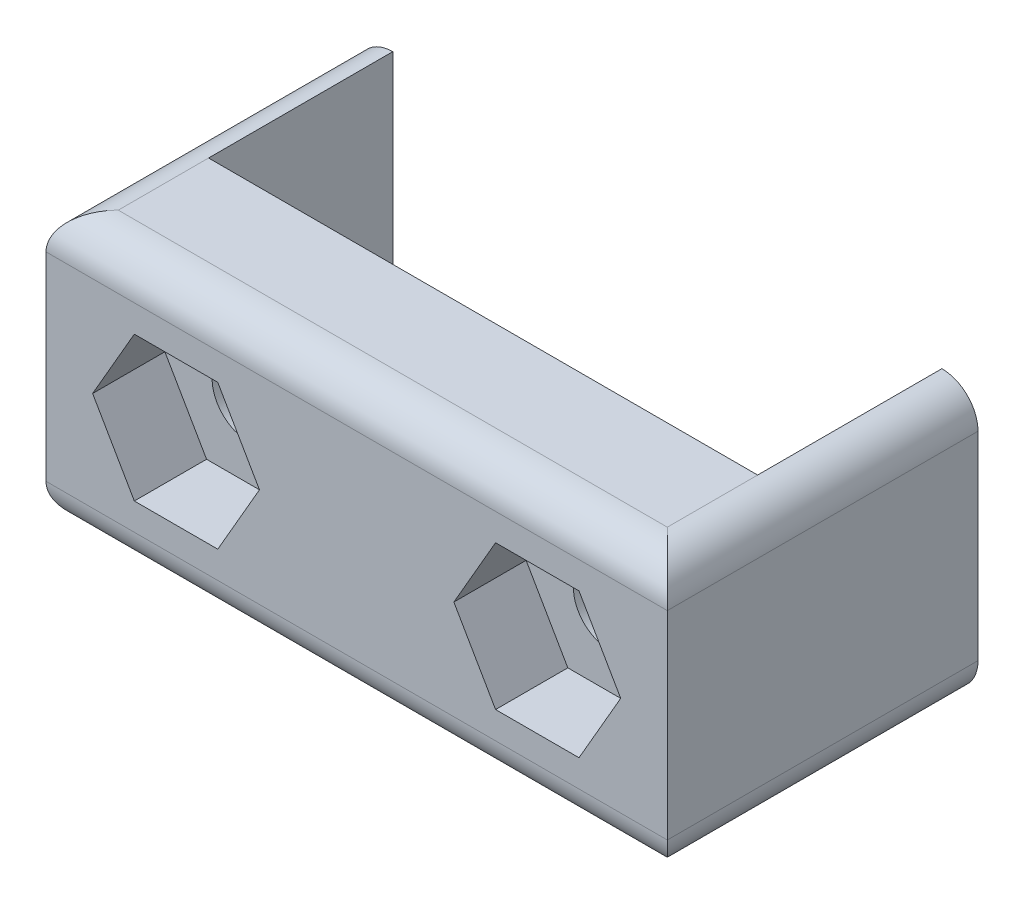
ISO-10303-21;
HEADER;
FILE_DESCRIPTION(('STEP AP214'),'2;1');
FILE_NAME('part.step','',(''),(''),'','','');
FILE_SCHEMA(('AUTOMOTIVE_DESIGN { 1 0 10303 214 1 1 1 1 }'));
ENDSEC;
DATA;
#1=APPLICATION_CONTEXT('core data for automotive mechanical design processes');
#2=APPLICATION_PROTOCOL_DEFINITION('international standard','automotive_design',2000,#1);
#3=PRODUCT_CONTEXT('',#1,'mechanical');
#4=PRODUCT('Part','Part','',(#3));
#5=PRODUCT_RELATED_PRODUCT_CATEGORY('part','',(#4));
#6=PRODUCT_DEFINITION_FORMATION('','',#4);
#7=PRODUCT_DEFINITION_CONTEXT('part definition',#1,'design');
#8=PRODUCT_DEFINITION('design','',#6,#7);
#9=PRODUCT_DEFINITION_SHAPE('','',#8);
#10=(LENGTH_UNIT() NAMED_UNIT(*) SI_UNIT(.MILLI.,.METRE.));
#11=(NAMED_UNIT(*) PLANE_ANGLE_UNIT() SI_UNIT($,.RADIAN.));
#12=(NAMED_UNIT(*) SI_UNIT($,.STERADIAN.) SOLID_ANGLE_UNIT());
#13=UNCERTAINTY_MEASURE_WITH_UNIT(LENGTH_MEASURE(1.E-05),#10,'distance_accuracy_value','');
#14=(GEOMETRIC_REPRESENTATION_CONTEXT(3) GLOBAL_UNCERTAINTY_ASSIGNED_CONTEXT((#13)) GLOBAL_UNIT_ASSIGNED_CONTEXT((#10,
#11,#12)) REPRESENTATION_CONTEXT('',''));
#15=CARTESIAN_POINT('',(0.,0.,0.));
#16=DIRECTION('',(0.,0.,1.));
#17=DIRECTION('',(1.,0.,0.));
#18=AXIS2_PLACEMENT_3D('',#15,#16,#17);
#19=CARTESIAN_POINT('',(12.7,9.525,0.));
#20=DIRECTION('',(0.,0.,1.));
#21=DIRECTION('',(1.,0.,0.));
#22=AXIS2_PLACEMENT_3D('',#19,#20,#21);
#23=CYLINDRICAL_SURFACE('',#22,2.54);
#24=CARTESIAN_POINT('',(12.7,9.525,12.954));
#25=DIRECTION('',(0.,0.,-1.));
#26=DIRECTION('',(-1.,0.,0.));
#27=AXIS2_PLACEMENT_3D('',#24,#25,#26);
#28=CIRCLE('',#27,2.54);
#29=CARTESIAN_POINT('',(10.16,9.525,12.954));
#30=VERTEX_POINT('',#29);
#31=EDGE_CURVE('E300',#30,#30,#28,.T.);
#32=ORIENTED_EDGE('',*,*,#31,.T.);
#33=EDGE_LOOP('',(#32));
#34=FACE_BOUND('',#33,.T.);
#35=CARTESIAN_POINT('',(12.7,9.525,16.764));
#36=DIRECTION('',(0.,0.,1.));
#37=DIRECTION('',(1.,0.,0.));
#38=AXIS2_PLACEMENT_3D('',#35,#36,#37);
#39=CIRCLE('',#38,2.54);
#40=CARTESIAN_POINT('',(15.24,9.525,16.764));
#41=VERTEX_POINT('',#40);
#42=EDGE_CURVE('E304',#41,#41,#39,.F.);
#43=ORIENTED_EDGE('',*,*,#42,.F.);
#44=EDGE_LOOP('',(#43));
#45=FACE_BOUND('',#44,.T.);
#46=ADVANCED_FACE('F39',(#34,#45),#23,.F.);
#47=CARTESIAN_POINT('',(-12.7,9.525,0.));
#48=DIRECTION('',(0.,0.,1.));
#49=DIRECTION('',(1.,0.,0.));
#50=AXIS2_PLACEMENT_3D('',#47,#48,#49);
#51=CYLINDRICAL_SURFACE('',#50,2.54);
#52=CARTESIAN_POINT('',(-12.7,9.525,12.954));
#53=DIRECTION('',(0.,0.,-1.));
#54=DIRECTION('',(-1.,0.,0.));
#55=AXIS2_PLACEMENT_3D('',#52,#53,#54);
#56=CIRCLE('',#55,2.54);
#57=CARTESIAN_POINT('',(-15.24,9.525,12.954));
#58=VERTEX_POINT('',#57);
#59=EDGE_CURVE('E303',#58,#58,#56,.T.);
#60=ORIENTED_EDGE('',*,*,#59,.T.);
#61=EDGE_LOOP('',(#60));
#62=FACE_BOUND('',#61,.T.);
#63=CARTESIAN_POINT('',(-12.7,9.525,16.764));
#64=DIRECTION('',(0.,0.,1.));
#65=DIRECTION('',(1.,0.,0.));
#66=AXIS2_PLACEMENT_3D('',#63,#64,#65);
#67=CIRCLE('',#66,2.54);
#68=CARTESIAN_POINT('',(-10.16,9.525,16.764));
#69=VERTEX_POINT('',#68);
#70=EDGE_CURVE('E244',#69,#69,#67,.F.);
#71=ORIENTED_EDGE('',*,*,#70,.F.);
#72=EDGE_LOOP('',(#71));
#73=FACE_BOUND('',#72,.T.);
#74=ADVANCED_FACE('F450',(#62,#73),#51,.F.);
#75=CARTESIAN_POINT('',(21.844,19.05,0.));
#76=DIRECTION('',(1.,0.,0.));
#77=DIRECTION('',(0.,0.,-1.));
#78=AXIS2_PLACEMENT_3D('',#75,#76,#77);
#79=PLANE('',#78);
#80=DIRECTION('',(0.,-1.,0.));
#81=VECTOR('',#80,1.);
#82=CARTESIAN_POINT('',(21.844,19.05,21.844));
#83=LINE('',#82,#81);
#84=CARTESIAN_POINT('',(21.844,16.51,21.844));
#85=VERTEX_POINT('',#84);
#86=CARTESIAN_POINT('',(21.844,2.54000000000001,21.844));
#87=VERTEX_POINT('',#86);
#88=EDGE_CURVE('E318',#85,#87,#83,.T.);
#89=ORIENTED_EDGE('',*,*,#88,.T.);
#90=DIRECTION('',(0.,0.,1.));
#91=VECTOR('',#90,1.);
#92=CARTESIAN_POINT('',(21.844,2.54,0.));
#93=LINE('',#92,#91);
#94=CARTESIAN_POINT('',(21.844,2.54000000000001,0.));
#95=VERTEX_POINT('',#94);
#96=EDGE_CURVE('E48',#87,#95,#93,.F.);
#97=ORIENTED_EDGE('',*,*,#96,.T.);
#98=DIRECTION('',(0.,-1.,0.));
#99=VECTOR('',#98,1.);
#100=CARTESIAN_POINT('',(21.844,19.05,0.));
#101=LINE('',#100,#99);
#102=CARTESIAN_POINT('',(21.844,16.51,0.));
#103=VERTEX_POINT('',#102);
#104=EDGE_CURVE('E342',#103,#95,#101,.T.);
#105=ORIENTED_EDGE('',*,*,#104,.F.);
#106=DIRECTION('',(0.,0.,1.));
#107=VECTOR('',#106,1.);
#108=CARTESIAN_POINT('',(21.844,16.51,0.));
#109=LINE('',#108,#107);
#110=EDGE_CURVE('E358',#103,#85,#109,.T.);
#111=ORIENTED_EDGE('',*,*,#110,.T.);
#112=EDGE_LOOP('',(#89,#97,#105,#111));
#113=FACE_BOUND('',#112,.T.);
#114=ADVANCED_FACE('F407',(#113),#79,.T.);
#115=CARTESIAN_POINT('',(0.,19.05,0.));
#116=DIRECTION('',(0.,0.,-1.));
#117=DIRECTION('',(-1.,0.,0.));
#118=AXIS2_PLACEMENT_3D('',#115,#116,#117);
#119=PLANE('',#118);
#120=ORIENTED_EDGE('',*,*,#104,.T.);
#121=CARTESIAN_POINT('',(19.304,2.54,0.));
#122=DIRECTION('',(0.,0.,-1.));
#123=DIRECTION('',(-1.,0.,0.));
#124=AXIS2_PLACEMENT_3D('',#121,#122,#123);
#125=CIRCLE('',#124,2.54);
#126=CARTESIAN_POINT('',(19.304,0.,0.));
#127=VERTEX_POINT('',#126);
#128=EDGE_CURVE('E11',#95,#127,#125,.T.);
#129=ORIENTED_EDGE('',*,*,#128,.T.);
#130=DIRECTION('',(0.,-1.,0.));
#131=VECTOR('',#130,1.);
#132=CARTESIAN_POINT('',(19.304,19.05,0.));
#133=LINE('',#132,#131);
#134=CARTESIAN_POINT('',(19.304,19.05,0.));
#135=VERTEX_POINT('',#134);
#136=EDGE_CURVE('E339',#135,#127,#133,.T.);
#137=ORIENTED_EDGE('',*,*,#136,.F.);
#138=CARTESIAN_POINT('',(19.304,16.51,0.));
#139=DIRECTION('',(0.,0.,-1.));
#140=DIRECTION('',(-1.,0.,0.));
#141=AXIS2_PLACEMENT_3D('',#138,#139,#140);
#142=CIRCLE('',#141,2.54);
#143=EDGE_CURVE('E360',#135,#103,#142,.T.);
#144=ORIENTED_EDGE('',*,*,#143,.T.);
#145=EDGE_LOOP('',(#120,#129,#137,#144));
#146=FACE_BOUND('',#145,.T.);
#147=ADVANCED_FACE('F396',(#146),#119,.T.);
#148=CARTESIAN_POINT('',(19.304,19.05,0.));
#149=DIRECTION('',(1.,0.,0.));
#150=DIRECTION('',(0.,0.,-1.));
#151=AXIS2_PLACEMENT_3D('',#148,#149,#150);
#152=PLANE('',#151);
#153=DIRECTION('',(0.,0.,1.));
#154=VECTOR('',#153,1.);
#155=CARTESIAN_POINT('',(19.304,0.,0.));
#156=LINE('',#155,#154);
#157=CARTESIAN_POINT('',(19.304,0.,12.954));
#158=VERTEX_POINT('',#157);
#159=EDGE_CURVE('E307',#127,#158,#156,.T.);
#160=ORIENTED_EDGE('',*,*,#159,.T.);
#161=DIRECTION('',(0.,-1.,0.));
#162=VECTOR('',#161,1.);
#163=CARTESIAN_POINT('',(19.304,19.05,12.954));
#164=LINE('',#163,#162);
#165=CARTESIAN_POINT('',(19.304,19.05,12.954));
#166=VERTEX_POINT('',#165);
#167=EDGE_CURVE('E337',#166,#158,#164,.T.);
#168=ORIENTED_EDGE('',*,*,#167,.F.);
#169=DIRECTION('',(0.,0.,1.));
#170=VECTOR('',#169,1.);
#171=CARTESIAN_POINT('',(19.304,19.05,0.));
#172=LINE('',#171,#170);
#173=EDGE_CURVE('E308',#135,#166,#172,.T.);
#174=ORIENTED_EDGE('',*,*,#173,.F.);
#175=ORIENTED_EDGE('',*,*,#136,.T.);
#176=EDGE_LOOP('',(#160,#168,#174,#175));
#177=FACE_BOUND('',#176,.T.);
#178=ADVANCED_FACE('F399',(#177),#152,.F.);
#179=CARTESIAN_POINT('',(0.,19.05,12.954));
#180=DIRECTION('',(0.,0.,-1.));
#181=DIRECTION('',(-1.,0.,0.));
#182=AXIS2_PLACEMENT_3D('',#179,#180,#181);
#183=PLANE('',#182);
#184=ORIENTED_EDGE('',*,*,#59,.F.);
#185=EDGE_LOOP('',(#184));
#186=FACE_BOUND('',#185,.T.);
#187=ORIENTED_EDGE('',*,*,#31,.F.);
#188=EDGE_LOOP('',(#187));
#189=FACE_BOUND('',#188,.T.);
#190=DIRECTION('',(1.,0.,0.));
#191=VECTOR('',#190,1.);
#192=CARTESIAN_POINT('',(0.,0.,12.954));
#193=LINE('',#192,#191);
#194=CARTESIAN_POINT('',(-19.304,0.,12.954));
#195=VERTEX_POINT('',#194);
#196=EDGE_CURVE('E321',#195,#158,#193,.T.);
#197=ORIENTED_EDGE('',*,*,#196,.F.);
#198=DIRECTION('',(0.,-1.,0.));
#199=VECTOR('',#198,1.);
#200=CARTESIAN_POINT('',(-19.304,19.05,12.954));
#201=LINE('',#200,#199);
#202=CARTESIAN_POINT('',(-19.304,19.05,12.954));
#203=VERTEX_POINT('',#202);
#204=EDGE_CURVE('E334',#203,#195,#201,.T.);
#205=ORIENTED_EDGE('',*,*,#204,.F.);
#206=DIRECTION('',(1.,0.,0.));
#207=VECTOR('',#206,1.);
#208=CARTESIAN_POINT('',(0.,19.05,12.954));
#209=LINE('',#208,#207);
#210=EDGE_CURVE('E311',#203,#166,#209,.T.);
#211=ORIENTED_EDGE('',*,*,#210,.T.);
#212=ORIENTED_EDGE('',*,*,#167,.T.);
#213=EDGE_LOOP('',(#197,#205,#211,#212));
#214=FACE_BOUND('',#213,.T.);
#215=ADVANCED_FACE('F435',(#186,#189,#214),#183,.T.);
#216=CARTESIAN_POINT('',(-19.304,19.05,0.));
#217=DIRECTION('',(1.,0.,0.));
#218=DIRECTION('',(0.,0.,-1.));
#219=AXIS2_PLACEMENT_3D('',#216,#217,#218);
#220=PLANE('',#219);
#221=DIRECTION('',(0.,0.,1.));
#222=VECTOR('',#221,1.);
#223=CARTESIAN_POINT('',(-19.304,0.,0.));
#224=LINE('',#223,#222);
#225=CARTESIAN_POINT('',(-19.304,0.,0.));
#226=VERTEX_POINT('',#225);
#227=EDGE_CURVE('E312',#226,#195,#224,.T.);
#228=ORIENTED_EDGE('',*,*,#227,.F.);
#229=DIRECTION('',(0.,-1.,0.));
#230=VECTOR('',#229,1.);
#231=CARTESIAN_POINT('',(-19.304,19.05,0.));
#232=LINE('',#231,#230);
#233=CARTESIAN_POINT('',(-19.304,19.05,0.));
#234=VERTEX_POINT('',#233);
#235=EDGE_CURVE('E332',#234,#226,#232,.T.);
#236=ORIENTED_EDGE('',*,*,#235,.F.);
#237=DIRECTION('',(0.,0.,1.));
#238=VECTOR('',#237,1.);
#239=CARTESIAN_POINT('',(-19.304,19.05,0.));
#240=LINE('',#239,#238);
#241=EDGE_CURVE('E315',#234,#203,#240,.T.);
#242=ORIENTED_EDGE('',*,*,#241,.T.);
#243=ORIENTED_EDGE('',*,*,#204,.T.);
#244=EDGE_LOOP('',(#228,#236,#242,#243));
#245=FACE_BOUND('',#244,.T.);
#246=ADVANCED_FACE('F431',(#245),#220,.T.);
#247=ORIENTED_EDGE('',*,*,#235,.T.);
#248=CARTESIAN_POINT('',(-19.304,2.54,0.));
#249=DIRECTION('',(0.,0.,-1.));
#250=DIRECTION('',(-1.,0.,0.));
#251=AXIS2_PLACEMENT_3D('',#248,#249,#250);
#252=CIRCLE('',#251,2.54);
#253=CARTESIAN_POINT('',(-21.844,2.54000000000001,0.));
#254=VERTEX_POINT('',#253);
#255=EDGE_CURVE('E378',#226,#254,#252,.T.);
#256=ORIENTED_EDGE('',*,*,#255,.T.);
#257=DIRECTION('',(0.,-1.,0.));
#258=VECTOR('',#257,1.);
#259=CARTESIAN_POINT('',(-21.844,19.05,0.));
#260=LINE('',#259,#258);
#261=CARTESIAN_POINT('',(-21.844,16.51,0.));
#262=VERTEX_POINT('',#261);
#263=EDGE_CURVE('E329',#262,#254,#260,.T.);
#264=ORIENTED_EDGE('',*,*,#263,.F.);
#265=CARTESIAN_POINT('',(-19.304,16.51,0.));
#266=DIRECTION('',(0.,0.,-1.));
#267=DIRECTION('',(-1.,0.,0.));
#268=AXIS2_PLACEMENT_3D('',#265,#266,#267);
#269=CIRCLE('',#268,2.54);
#270=EDGE_CURVE('E356',#262,#234,#269,.T.);
#271=ORIENTED_EDGE('',*,*,#270,.T.);
#272=EDGE_LOOP('',(#247,#256,#264,#271));
#273=FACE_BOUND('',#272,.T.);
#274=ADVANCED_FACE('F425',(#273),#119,.T.);
#275=CARTESIAN_POINT('',(-21.844,19.05,0.));
#276=DIRECTION('',(1.,0.,0.));
#277=DIRECTION('',(0.,0.,-1.));
#278=AXIS2_PLACEMENT_3D('',#275,#276,#277);
#279=PLANE('',#278);
#280=ORIENTED_EDGE('',*,*,#263,.T.);
#281=DIRECTION('',(0.,0.,1.));
#282=VECTOR('',#281,1.);
#283=CARTESIAN_POINT('',(-21.844,2.54,0.));
#284=LINE('',#283,#282);
#285=CARTESIAN_POINT('',(-21.844,2.54000000000001,21.844));
#286=VERTEX_POINT('',#285);
#287=EDGE_CURVE('E364',#254,#286,#284,.T.);
#288=ORIENTED_EDGE('',*,*,#287,.T.);
#289=DIRECTION('',(0.,-1.,0.));
#290=VECTOR('',#289,1.);
#291=CARTESIAN_POINT('',(-21.844,19.05,21.844));
#292=LINE('',#291,#290);
#293=CARTESIAN_POINT('',(-21.844,16.51,21.844));
#294=VERTEX_POINT('',#293);
#295=EDGE_CURVE('E327',#294,#286,#292,.T.);
#296=ORIENTED_EDGE('',*,*,#295,.F.);
#297=DIRECTION('',(0.,0.,1.));
#298=VECTOR('',#297,1.);
#299=CARTESIAN_POINT('',(-21.844,16.51,0.));
#300=LINE('',#299,#298);
#301=EDGE_CURVE('E354',#294,#262,#300,.F.);
#302=ORIENTED_EDGE('',*,*,#301,.T.);
#303=EDGE_LOOP('',(#280,#288,#296,#302));
#304=FACE_BOUND('',#303,.T.);
#305=ADVANCED_FACE('F423',(#304),#279,.F.);
#306=CARTESIAN_POINT('',(0.,19.05,21.844));
#307=DIRECTION('',(0.,0.,-1.));
#308=DIRECTION('',(-1.,0.,0.));
#309=AXIS2_PLACEMENT_3D('',#306,#307,#308);
#310=PLANE('',#309);
#311=DIRECTION('',(0.5,0.866025403784439,0.));
#312=VECTOR('',#311,1.);
#313=CARTESIAN_POINT('',(-9.7670606325167,4.445,21.844));
#314=LINE('',#313,#312);
#315=CARTESIAN_POINT('',(-9.7670606325167,4.445,21.844));
#316=VERTEX_POINT('',#315);
#317=CARTESIAN_POINT('',(-6.8341212650334,9.525,21.844));
#318=VERTEX_POINT('',#317);
#319=EDGE_CURVE('E231',#316,#318,#314,.T.);
#320=ORIENTED_EDGE('',*,*,#319,.F.);
#321=DIRECTION('',(1.,0.,0.));
#322=VECTOR('',#321,1.);
#323=CARTESIAN_POINT('',(-15.6329393674833,4.445,21.844));
#324=LINE('',#323,#322);
#325=CARTESIAN_POINT('',(-15.6329393674833,4.445,21.844));
#326=VERTEX_POINT('',#325);
#327=EDGE_CURVE('E198',#326,#316,#324,.T.);
#328=ORIENTED_EDGE('',*,*,#327,.F.);
#329=DIRECTION('',(0.5,-0.866025403784439,0.));
#330=VECTOR('',#329,1.);
#331=CARTESIAN_POINT('',(-18.5658787349666,9.525,21.844));
#332=LINE('',#331,#330);
#333=CARTESIAN_POINT('',(-18.5658787349666,9.525,21.844));
#334=VERTEX_POINT('',#333);
#335=EDGE_CURVE('E217',#334,#326,#332,.T.);
#336=ORIENTED_EDGE('',*,*,#335,.F.);
#337=DIRECTION('',(-0.5,-0.866025403784438,0.));
#338=VECTOR('',#337,1.);
#339=CARTESIAN_POINT('',(-15.6329393674833,14.605,21.844));
#340=LINE('',#339,#338);
#341=CARTESIAN_POINT('',(-15.6329393674833,14.605,21.844));
#342=VERTEX_POINT('',#341);
#343=EDGE_CURVE('E220',#342,#334,#340,.T.);
#344=ORIENTED_EDGE('',*,*,#343,.F.);
#345=DIRECTION('',(-1.,0.,0.));
#346=VECTOR('',#345,1.);
#347=CARTESIAN_POINT('',(-9.76706063251669,14.605,21.844));
#348=LINE('',#347,#346);
#349=CARTESIAN_POINT('',(-9.76706063251669,14.605,21.844));
#350=VERTEX_POINT('',#349);
#351=EDGE_CURVE('E237',#350,#342,#348,.T.);
#352=ORIENTED_EDGE('',*,*,#351,.F.);
#353=DIRECTION('',(-0.5,0.866025403784439,0.));
#354=VECTOR('',#353,1.);
#355=CARTESIAN_POINT('',(-6.8341212650334,9.525,21.844));
#356=LINE('',#355,#354);
#357=EDGE_CURVE('E234',#318,#350,#356,.T.);
#358=ORIENTED_EDGE('',*,*,#357,.F.);
#359=EDGE_LOOP('',(#320,#328,#336,#344,#352,#358));
#360=FACE_BOUND('',#359,.T.);
#361=DIRECTION('',(0.5,0.866025403784439,0.));
#362=VECTOR('',#361,1.);
#363=CARTESIAN_POINT('',(15.6329393674833,4.445,21.844));
#364=LINE('',#363,#362);
#365=CARTESIAN_POINT('',(15.6329393674833,4.445,21.844));
#366=VERTEX_POINT('',#365);
#367=CARTESIAN_POINT('',(18.5658787349666,9.525,21.844));
#368=VERTEX_POINT('',#367);
#369=EDGE_CURVE('E280',#366,#368,#364,.T.);
#370=ORIENTED_EDGE('',*,*,#369,.F.);
#371=DIRECTION('',(1.,0.,0.));
#372=VECTOR('',#371,1.);
#373=CARTESIAN_POINT('',(9.7670606325167,4.445,21.844));
#374=LINE('',#373,#372);
#375=CARTESIAN_POINT('',(9.7670606325167,4.445,21.844));
#376=VERTEX_POINT('',#375);
#377=EDGE_CURVE('E232',#376,#366,#374,.T.);
#378=ORIENTED_EDGE('',*,*,#377,.F.);
#379=DIRECTION('',(0.5,-0.866025403784439,0.));
#380=VECTOR('',#379,1.);
#381=CARTESIAN_POINT('',(6.83412126503341,9.525,21.844));
#382=LINE('',#381,#380);
#383=CARTESIAN_POINT('',(6.83412126503341,9.525,21.844));
#384=VERTEX_POINT('',#383);
#385=EDGE_CURVE('E267',#384,#376,#382,.T.);
#386=ORIENTED_EDGE('',*,*,#385,.F.);
#387=DIRECTION('',(-0.5,-0.866025403784438,0.));
#388=VECTOR('',#387,1.);
#389=CARTESIAN_POINT('',(9.7670606325167,14.605,21.844));
#390=LINE('',#389,#388);
#391=CARTESIAN_POINT('',(9.7670606325167,14.605,21.844));
#392=VERTEX_POINT('',#391);
#393=EDGE_CURVE('E270',#392,#384,#390,.T.);
#394=ORIENTED_EDGE('',*,*,#393,.F.);
#395=DIRECTION('',(-1.,0.,0.));
#396=VECTOR('',#395,1.);
#397=CARTESIAN_POINT('',(15.6329393674833,14.605,21.844));
#398=LINE('',#397,#396);
#399=CARTESIAN_POINT('',(15.6329393674833,14.605,21.844));
#400=VERTEX_POINT('',#399);
#401=EDGE_CURVE('E274',#400,#392,#398,.T.);
#402=ORIENTED_EDGE('',*,*,#401,.F.);
#403=DIRECTION('',(-0.5,0.866025403784439,0.));
#404=VECTOR('',#403,1.);
#405=CARTESIAN_POINT('',(18.5658787349666,9.525,21.844));
#406=LINE('',#405,#404);
#407=EDGE_CURVE('E277',#368,#400,#406,.T.);
#408=ORIENTED_EDGE('',*,*,#407,.F.);
#409=EDGE_LOOP('',(#370,#378,#386,#394,#402,#408));
#410=FACE_BOUND('',#409,.T.);
#411=ORIENTED_EDGE('',*,*,#295,.T.);
#412=DIRECTION('',(1.,0.,0.));
#413=VECTOR('',#412,1.);
#414=CARTESIAN_POINT('',(0.,2.54,21.844));
#415=LINE('',#414,#413);
#416=EDGE_CURVE('E63',#286,#87,#415,.T.);
#417=ORIENTED_EDGE('',*,*,#416,.T.);
#418=ORIENTED_EDGE('',*,*,#88,.F.);
#419=DIRECTION('',(1.,0.,0.));
#420=VECTOR('',#419,1.);
#421=CARTESIAN_POINT('',(-21.844,16.51,21.844));
#422=LINE('',#421,#420);
#423=EDGE_CURVE('E362',#85,#294,#422,.F.);
#424=ORIENTED_EDGE('',*,*,#423,.T.);
#425=EDGE_LOOP('',(#411,#417,#418,#424));
#426=FACE_BOUND('',#425,.T.);
#427=ADVANCED_FACE('F408',(#360,#410,#426),#310,.F.);
#428=CARTESIAN_POINT('',(0.,19.05,0.));
#429=DIRECTION('',(0.,1.,0.));
#430=DIRECTION('',(0.,0.,1.));
#431=AXIS2_PLACEMENT_3D('',#428,#429,#430);
#432=PLANE('',#431);
#433=ORIENTED_EDGE('',*,*,#210,.F.);
#434=DIRECTION('',(0.,0.,1.));
#435=VECTOR('',#434,1.);
#436=CARTESIAN_POINT('',(-19.304,19.05,21.844));
#437=LINE('',#436,#435);
#438=CARTESIAN_POINT('',(-19.304,19.05,19.304));
#439=VERTEX_POINT('',#438);
#440=EDGE_CURVE('E352',#203,#439,#437,.T.);
#441=ORIENTED_EDGE('',*,*,#440,.T.);
#442=DIRECTION('',(1.,0.,0.));
#443=VECTOR('',#442,1.);
#444=CARTESIAN_POINT('',(21.844,19.05,19.304));
#445=LINE('',#444,#443);
#446=CARTESIAN_POINT('',(19.304,19.05,19.304));
#447=VERTEX_POINT('',#446);
#448=EDGE_CURVE('E344',#439,#447,#445,.T.);
#449=ORIENTED_EDGE('',*,*,#448,.T.);
#450=DIRECTION('',(0.,0.,1.));
#451=VECTOR('',#450,1.);
#452=CARTESIAN_POINT('',(19.304,19.05,0.));
#453=LINE('',#452,#451);
#454=EDGE_CURVE('E350',#447,#166,#453,.F.);
#455=ORIENTED_EDGE('',*,*,#454,.T.);
#456=EDGE_LOOP('',(#433,#441,#449,#455));
#457=FACE_BOUND('',#456,.T.);
#458=ADVANCED_FACE('F439',(#457),#432,.T.);
#459=CARTESIAN_POINT('',(0.,0.,0.));
#460=DIRECTION('',(0.,1.,0.));
#461=DIRECTION('',(0.,0.,1.));
#462=AXIS2_PLACEMENT_3D('',#459,#460,#461);
#463=PLANE('',#462);
#464=DIRECTION('',(1.,0.,0.));
#465=VECTOR('',#464,1.);
#466=CARTESIAN_POINT('',(0.,0.,19.304));
#467=LINE('',#466,#465);
#468=CARTESIAN_POINT('',(19.304,0.,19.304));
#469=VERTEX_POINT('',#468);
#470=CARTESIAN_POINT('',(-19.304,0.,19.304));
#471=VERTEX_POINT('',#470);
#472=EDGE_CURVE('E374',#469,#471,#467,.F.);
#473=ORIENTED_EDGE('',*,*,#472,.T.);
#474=DIRECTION('',(0.,0.,1.));
#475=VECTOR('',#474,1.);
#476=CARTESIAN_POINT('',(-19.304,0.,0.));
#477=LINE('',#476,#475);
#478=EDGE_CURVE('E376',#471,#195,#477,.F.);
#479=ORIENTED_EDGE('',*,*,#478,.T.);
#480=ORIENTED_EDGE('',*,*,#196,.T.);
#481=DIRECTION('',(0.,0.,1.));
#482=VECTOR('',#481,1.);
#483=CARTESIAN_POINT('',(19.304,0.,21.844));
#484=LINE('',#483,#482);
#485=EDGE_CURVE('E372',#158,#469,#484,.T.);
#486=ORIENTED_EDGE('',*,*,#485,.T.);
#487=EDGE_LOOP('',(#473,#479,#480,#486));
#488=FACE_BOUND('',#487,.T.);
#489=ADVANCED_FACE('F437',(#488),#463,.F.);
#490=CARTESIAN_POINT('',(0.,0.,16.764));
#491=DIRECTION('',(0.,0.,1.));
#492=DIRECTION('',(1.,0.,0.));
#493=AXIS2_PLACEMENT_3D('',#490,#491,#492);
#494=PLANE('',#493);
#495=DIRECTION('',(1.,0.,0.));
#496=VECTOR('',#495,1.);
#497=CARTESIAN_POINT('',(-15.6329393674833,4.445,16.764));
#498=LINE('',#497,#496);
#499=CARTESIAN_POINT('',(-15.6329393674833,4.445,16.764));
#500=VERTEX_POINT('',#499);
#501=CARTESIAN_POINT('',(-9.7670606325167,4.445,16.764));
#502=VERTEX_POINT('',#501);
#503=EDGE_CURVE('E195',#500,#502,#498,.T.);
#504=ORIENTED_EDGE('',*,*,#503,.T.);
#505=DIRECTION('',(0.5,0.866025403784439,0.));
#506=VECTOR('',#505,1.);
#507=CARTESIAN_POINT('',(-9.7670606325167,4.445,16.764));
#508=LINE('',#507,#506);
#509=CARTESIAN_POINT('',(-6.8341212650334,9.525,16.764));
#510=VERTEX_POINT('',#509);
#511=EDGE_CURVE('E206',#502,#510,#508,.T.);
#512=ORIENTED_EDGE('',*,*,#511,.T.);
#513=DIRECTION('',(-0.5,0.866025403784439,0.));
#514=VECTOR('',#513,1.);
#515=CARTESIAN_POINT('',(-6.8341212650334,9.525,16.764));
#516=LINE('',#515,#514);
#517=CARTESIAN_POINT('',(-9.76706063251669,14.605,16.764));
#518=VERTEX_POINT('',#517);
#519=EDGE_CURVE('E211',#510,#518,#516,.T.);
#520=ORIENTED_EDGE('',*,*,#519,.T.);
#521=DIRECTION('',(-1.,0.,0.));
#522=VECTOR('',#521,1.);
#523=CARTESIAN_POINT('',(-9.76706063251669,14.605,16.764));
#524=LINE('',#523,#522);
#525=CARTESIAN_POINT('',(-15.6329393674833,14.605,16.764));
#526=VERTEX_POINT('',#525);
#527=EDGE_CURVE('E224',#518,#526,#524,.T.);
#528=ORIENTED_EDGE('',*,*,#527,.T.);
#529=DIRECTION('',(-0.5,-0.866025403784438,0.));
#530=VECTOR('',#529,1.);
#531=CARTESIAN_POINT('',(-15.6329393674833,14.605,16.764));
#532=LINE('',#531,#530);
#533=CARTESIAN_POINT('',(-18.5658787349666,9.525,16.764));
#534=VERTEX_POINT('',#533);
#535=EDGE_CURVE('E227',#526,#534,#532,.T.);
#536=ORIENTED_EDGE('',*,*,#535,.T.);
#537=DIRECTION('',(0.5,-0.866025403784439,0.));
#538=VECTOR('',#537,1.);
#539=CARTESIAN_POINT('',(-18.5658787349666,9.525,16.764));
#540=LINE('',#539,#538);
#541=EDGE_CURVE('E203',#534,#500,#540,.T.);
#542=ORIENTED_EDGE('',*,*,#541,.T.);
#543=EDGE_LOOP('',(#504,#512,#520,#528,#536,#542));
#544=FACE_BOUND('',#543,.T.);
#545=ORIENTED_EDGE('',*,*,#70,.T.);
#546=EDGE_LOOP('',(#545));
#547=FACE_BOUND('',#546,.T.);
#548=ADVANCED_FACE('F213',(#544,#547),#494,.T.);
#549=CARTESIAN_POINT('',(-15.6329393674833,4.445,16.764));
#550=DIRECTION('',(0.,-1.,0.));
#551=DIRECTION('',(0.,0.,-1.));
#552=AXIS2_PLACEMENT_3D('',#549,#550,#551);
#553=PLANE('',#552);
#554=ORIENTED_EDGE('',*,*,#327,.T.);
#555=DIRECTION('',(0.,0.,1.));
#556=VECTOR('',#555,1.);
#557=CARTESIAN_POINT('',(-9.7670606325167,4.445,16.764));
#558=LINE('',#557,#556);
#559=EDGE_CURVE('E191',#502,#316,#558,.T.);
#560=ORIENTED_EDGE('',*,*,#559,.F.);
#561=ORIENTED_EDGE('',*,*,#503,.F.);
#562=DIRECTION('',(0.,0.,1.));
#563=VECTOR('',#562,1.);
#564=CARTESIAN_POINT('',(-15.6329393674833,4.445,16.764));
#565=LINE('',#564,#563);
#566=EDGE_CURVE('E242',#500,#326,#565,.T.);
#567=ORIENTED_EDGE('',*,*,#566,.T.);
#568=EDGE_LOOP('',(#554,#560,#561,#567));
#569=FACE_BOUND('',#568,.T.);
#570=ADVANCED_FACE('F193',(#569),#553,.F.);
#571=CARTESIAN_POINT('',(-18.5658787349666,9.525,16.764));
#572=DIRECTION('',(-0.866025403784439,-0.5,0.));
#573=DIRECTION('',(0.5,-0.866025403784439,0.));
#574=AXIS2_PLACEMENT_3D('',#571,#572,#573);
#575=PLANE('',#574);
#576=ORIENTED_EDGE('',*,*,#335,.T.);
#577=ORIENTED_EDGE('',*,*,#566,.F.);
#578=ORIENTED_EDGE('',*,*,#541,.F.);
#579=DIRECTION('',(0.,0.,1.));
#580=VECTOR('',#579,1.);
#581=CARTESIAN_POINT('',(-18.5658787349666,9.525,16.764));
#582=LINE('',#581,#580);
#583=EDGE_CURVE('E245',#534,#334,#582,.T.);
#584=ORIENTED_EDGE('',*,*,#583,.T.);
#585=EDGE_LOOP('',(#576,#577,#578,#584));
#586=FACE_BOUND('',#585,.T.);
#587=ADVANCED_FACE('F490',(#586),#575,.F.);
#588=CARTESIAN_POINT('',(-15.6329393674833,14.605,16.764));
#589=DIRECTION('',(-0.866025403784438,0.5,0.));
#590=DIRECTION('',(-0.5,-0.866025403784439,0.));
#591=AXIS2_PLACEMENT_3D('',#588,#589,#590);
#592=PLANE('',#591);
#593=ORIENTED_EDGE('',*,*,#343,.T.);
#594=ORIENTED_EDGE('',*,*,#583,.F.);
#595=ORIENTED_EDGE('',*,*,#535,.F.);
#596=DIRECTION('',(0.,0.,1.));
#597=VECTOR('',#596,1.);
#598=CARTESIAN_POINT('',(-15.6329393674833,14.605,16.764));
#599=LINE('',#598,#597);
#600=EDGE_CURVE('E247',#526,#342,#599,.T.);
#601=ORIENTED_EDGE('',*,*,#600,.T.);
#602=EDGE_LOOP('',(#593,#594,#595,#601));
#603=FACE_BOUND('',#602,.T.);
#604=ADVANCED_FACE('F500',(#603),#592,.F.);
#605=CARTESIAN_POINT('',(-9.76706063251669,14.605,16.764));
#606=DIRECTION('',(0.,1.,0.));
#607=DIRECTION('',(0.,0.,1.));
#608=AXIS2_PLACEMENT_3D('',#605,#606,#607);
#609=PLANE('',#608);
#610=ORIENTED_EDGE('',*,*,#351,.T.);
#611=ORIENTED_EDGE('',*,*,#600,.F.);
#612=ORIENTED_EDGE('',*,*,#527,.F.);
#613=DIRECTION('',(0.,0.,1.));
#614=VECTOR('',#613,1.);
#615=CARTESIAN_POINT('',(-9.76706063251669,14.605,16.764));
#616=LINE('',#615,#614);
#617=EDGE_CURVE('E249',#518,#350,#616,.T.);
#618=ORIENTED_EDGE('',*,*,#617,.T.);
#619=EDGE_LOOP('',(#610,#611,#612,#618));
#620=FACE_BOUND('',#619,.T.);
#621=ADVANCED_FACE('F496',(#620),#609,.F.);
#622=CARTESIAN_POINT('',(-6.8341212650334,9.525,16.764));
#623=DIRECTION('',(0.866025403784439,0.5,0.));
#624=DIRECTION('',(-0.5,0.866025403784439,0.));
#625=AXIS2_PLACEMENT_3D('',#622,#623,#624);
#626=PLANE('',#625);
#627=ORIENTED_EDGE('',*,*,#357,.T.);
#628=ORIENTED_EDGE('',*,*,#617,.F.);
#629=ORIENTED_EDGE('',*,*,#519,.F.);
#630=DIRECTION('',(0.,0.,1.));
#631=VECTOR('',#630,1.);
#632=CARTESIAN_POINT('',(-6.8341212650334,9.525,16.764));
#633=LINE('',#632,#631);
#634=EDGE_CURVE('E202',#510,#318,#633,.T.);
#635=ORIENTED_EDGE('',*,*,#634,.T.);
#636=EDGE_LOOP('',(#627,#628,#629,#635));
#637=FACE_BOUND('',#636,.T.);
#638=ADVANCED_FACE('F493',(#637),#626,.F.);
#639=CARTESIAN_POINT('',(-9.7670606325167,4.445,16.764));
#640=DIRECTION('',(0.866025403784438,-0.5,0.));
#641=DIRECTION('',(0.5,0.866025403784439,0.));
#642=AXIS2_PLACEMENT_3D('',#639,#640,#641);
#643=PLANE('',#642);
#644=ORIENTED_EDGE('',*,*,#319,.T.);
#645=ORIENTED_EDGE('',*,*,#634,.F.);
#646=ORIENTED_EDGE('',*,*,#511,.F.);
#647=ORIENTED_EDGE('',*,*,#559,.T.);
#648=EDGE_LOOP('',(#644,#645,#646,#647));
#649=FACE_BOUND('',#648,.T.);
#650=ADVANCED_FACE('F207',(#649),#643,.F.);
#651=CARTESIAN_POINT('',(0.,0.,16.764));
#652=DIRECTION('',(0.,0.,1.));
#653=DIRECTION('',(1.,0.,0.));
#654=AXIS2_PLACEMENT_3D('',#651,#652,#653);
#655=PLANE('',#654);
#656=DIRECTION('',(1.,0.,0.));
#657=VECTOR('',#656,1.);
#658=CARTESIAN_POINT('',(9.7670606325167,4.445,16.764));
#659=LINE('',#658,#657);
#660=CARTESIAN_POINT('',(9.7670606325167,4.445,16.764));
#661=VERTEX_POINT('',#660);
#662=CARTESIAN_POINT('',(15.6329393674833,4.445,16.764));
#663=VERTEX_POINT('',#662);
#664=EDGE_CURVE('E271',#661,#663,#659,.T.);
#665=ORIENTED_EDGE('',*,*,#664,.T.);
#666=DIRECTION('',(0.5,0.866025403784439,0.));
#667=VECTOR('',#666,1.);
#668=CARTESIAN_POINT('',(15.6329393674833,4.445,16.764));
#669=LINE('',#668,#667);
#670=CARTESIAN_POINT('',(18.5658787349666,9.525,16.764));
#671=VERTEX_POINT('',#670);
#672=EDGE_CURVE('E295',#663,#671,#669,.T.);
#673=ORIENTED_EDGE('',*,*,#672,.T.);
#674=DIRECTION('',(-0.5,0.866025403784439,0.));
#675=VECTOR('',#674,1.);
#676=CARTESIAN_POINT('',(18.5658787349666,9.525,16.764));
#677=LINE('',#676,#675);
#678=CARTESIAN_POINT('',(15.6329393674833,14.605,16.764));
#679=VERTEX_POINT('',#678);
#680=EDGE_CURVE('E292',#671,#679,#677,.T.);
#681=ORIENTED_EDGE('',*,*,#680,.T.);
#682=DIRECTION('',(-1.,0.,0.));
#683=VECTOR('',#682,1.);
#684=CARTESIAN_POINT('',(15.6329393674833,14.605,16.764));
#685=LINE('',#684,#683);
#686=CARTESIAN_POINT('',(9.7670606325167,14.605,16.764));
#687=VERTEX_POINT('',#686);
#688=EDGE_CURVE('E289',#679,#687,#685,.T.);
#689=ORIENTED_EDGE('',*,*,#688,.T.);
#690=DIRECTION('',(-0.5,-0.866025403784438,0.));
#691=VECTOR('',#690,1.);
#692=CARTESIAN_POINT('',(9.7670606325167,14.605,16.764));
#693=LINE('',#692,#691);
#694=CARTESIAN_POINT('',(6.83412126503341,9.525,16.764));
#695=VERTEX_POINT('',#694);
#696=EDGE_CURVE('E286',#687,#695,#693,.T.);
#697=ORIENTED_EDGE('',*,*,#696,.T.);
#698=DIRECTION('',(0.5,-0.866025403784439,0.));
#699=VECTOR('',#698,1.);
#700=CARTESIAN_POINT('',(6.83412126503341,9.525,16.764));
#701=LINE('',#700,#699);
#702=EDGE_CURVE('E255',#695,#661,#701,.T.);
#703=ORIENTED_EDGE('',*,*,#702,.T.);
#704=EDGE_LOOP('',(#665,#673,#681,#689,#697,#703));
#705=FACE_BOUND('',#704,.T.);
#706=ORIENTED_EDGE('',*,*,#42,.T.);
#707=EDGE_LOOP('',(#706));
#708=FACE_BOUND('',#707,.T.);
#709=ADVANCED_FACE('F460',(#705,#708),#655,.T.);
#710=CARTESIAN_POINT('',(9.7670606325167,4.445,16.764));
#711=DIRECTION('',(0.,-1.,0.));
#712=DIRECTION('',(0.,0.,-1.));
#713=AXIS2_PLACEMENT_3D('',#710,#711,#712);
#714=PLANE('',#713);
#715=ORIENTED_EDGE('',*,*,#377,.T.);
#716=DIRECTION('',(0.,0.,1.));
#717=VECTOR('',#716,1.);
#718=CARTESIAN_POINT('',(15.6329393674833,4.445,16.764));
#719=LINE('',#718,#717);
#720=EDGE_CURVE('E252',#663,#366,#719,.T.);
#721=ORIENTED_EDGE('',*,*,#720,.F.);
#722=ORIENTED_EDGE('',*,*,#664,.F.);
#723=DIRECTION('',(0.,0.,1.));
#724=VECTOR('',#723,1.);
#725=CARTESIAN_POINT('',(9.7670606325167,4.445,16.764));
#726=LINE('',#725,#724);
#727=EDGE_CURVE('E264',#661,#376,#726,.T.);
#728=ORIENTED_EDGE('',*,*,#727,.T.);
#729=EDGE_LOOP('',(#715,#721,#722,#728));
#730=FACE_BOUND('',#729,.T.);
#731=ADVANCED_FACE('F463',(#730),#714,.F.);
#732=CARTESIAN_POINT('',(6.83412126503341,9.525,16.764));
#733=DIRECTION('',(-0.866025403784439,-0.5,0.));
#734=DIRECTION('',(0.5,-0.866025403784439,0.));
#735=AXIS2_PLACEMENT_3D('',#732,#733,#734);
#736=PLANE('',#735);
#737=ORIENTED_EDGE('',*,*,#385,.T.);
#738=ORIENTED_EDGE('',*,*,#727,.F.);
#739=ORIENTED_EDGE('',*,*,#702,.F.);
#740=DIRECTION('',(0.,0.,1.));
#741=VECTOR('',#740,1.);
#742=CARTESIAN_POINT('',(6.83412126503341,9.525,16.764));
#743=LINE('',#742,#741);
#744=EDGE_CURVE('E262',#695,#384,#743,.T.);
#745=ORIENTED_EDGE('',*,*,#744,.T.);
#746=EDGE_LOOP('',(#737,#738,#739,#745));
#747=FACE_BOUND('',#746,.T.);
#748=ADVANCED_FACE('F465',(#747),#736,.F.);
#749=CARTESIAN_POINT('',(9.7670606325167,14.605,16.764));
#750=DIRECTION('',(-0.866025403784438,0.5,0.));
#751=DIRECTION('',(-0.5,-0.866025403784438,0.));
#752=AXIS2_PLACEMENT_3D('',#749,#750,#751);
#753=PLANE('',#752);
#754=ORIENTED_EDGE('',*,*,#393,.T.);
#755=ORIENTED_EDGE('',*,*,#744,.F.);
#756=ORIENTED_EDGE('',*,*,#696,.F.);
#757=DIRECTION('',(0.,0.,1.));
#758=VECTOR('',#757,1.);
#759=CARTESIAN_POINT('',(9.7670606325167,14.605,16.764));
#760=LINE('',#759,#758);
#761=EDGE_CURVE('E260',#687,#392,#760,.T.);
#762=ORIENTED_EDGE('',*,*,#761,.T.);
#763=EDGE_LOOP('',(#754,#755,#756,#762));
#764=FACE_BOUND('',#763,.T.);
#765=ADVANCED_FACE('F468',(#764),#753,.F.);
#766=CARTESIAN_POINT('',(15.6329393674833,14.605,16.764));
#767=DIRECTION('',(0.,1.,0.));
#768=DIRECTION('',(-1.,0.,0.));
#769=AXIS2_PLACEMENT_3D('',#766,#767,#768);
#770=PLANE('',#769);
#771=ORIENTED_EDGE('',*,*,#401,.T.);
#772=ORIENTED_EDGE('',*,*,#761,.F.);
#773=ORIENTED_EDGE('',*,*,#688,.F.);
#774=DIRECTION('',(0.,0.,1.));
#775=VECTOR('',#774,1.);
#776=CARTESIAN_POINT('',(15.6329393674833,14.605,16.764));
#777=LINE('',#776,#775);
#778=EDGE_CURVE('E258',#679,#400,#777,.T.);
#779=ORIENTED_EDGE('',*,*,#778,.T.);
#780=EDGE_LOOP('',(#771,#772,#773,#779));
#781=FACE_BOUND('',#780,.T.);
#782=ADVANCED_FACE('F472',(#781),#770,.F.);
#783=CARTESIAN_POINT('',(18.5658787349666,9.525,16.764));
#784=DIRECTION('',(0.866025403784439,0.5,0.));
#785=DIRECTION('',(-0.5,0.866025403784439,0.));
#786=AXIS2_PLACEMENT_3D('',#783,#784,#785);
#787=PLANE('',#786);
#788=ORIENTED_EDGE('',*,*,#407,.T.);
#789=ORIENTED_EDGE('',*,*,#778,.F.);
#790=ORIENTED_EDGE('',*,*,#680,.F.);
#791=DIRECTION('',(0.,0.,1.));
#792=VECTOR('',#791,1.);
#793=CARTESIAN_POINT('',(18.5658787349666,9.525,16.764));
#794=LINE('',#793,#792);
#795=EDGE_CURVE('E256',#671,#368,#794,.T.);
#796=ORIENTED_EDGE('',*,*,#795,.T.);
#797=EDGE_LOOP('',(#788,#789,#790,#796));
#798=FACE_BOUND('',#797,.T.);
#799=ADVANCED_FACE('F476',(#798),#787,.F.);
#800=CARTESIAN_POINT('',(15.6329393674833,4.445,16.764));
#801=DIRECTION('',(0.866025403784438,-0.5,0.));
#802=DIRECTION('',(0.5,0.866025403784439,0.));
#803=AXIS2_PLACEMENT_3D('',#800,#801,#802);
#804=PLANE('',#803);
#805=ORIENTED_EDGE('',*,*,#369,.T.);
#806=ORIENTED_EDGE('',*,*,#795,.F.);
#807=ORIENTED_EDGE('',*,*,#672,.F.);
#808=ORIENTED_EDGE('',*,*,#720,.T.);
#809=EDGE_LOOP('',(#805,#806,#807,#808));
#810=FACE_BOUND('',#809,.T.);
#811=ADVANCED_FACE('F480',(#810),#804,.F.);
#812=CARTESIAN_POINT('',(19.304,16.51,0.));
#813=DIRECTION('',(0.,0.,1.));
#814=DIRECTION('',(1.,0.,0.));
#815=AXIS2_PLACEMENT_3D('',#812,#813,#814);
#816=CYLINDRICAL_SURFACE('',#815,2.54);
#817=ORIENTED_EDGE('',*,*,#173,.T.);
#818=ORIENTED_EDGE('',*,*,#454,.F.);
#819=CARTESIAN_POINT('',(19.304,16.51,19.304));
#820=DIRECTION('',(-0.707106781186547,0.,0.707106781186548));
#821=DIRECTION('',(-0.707106781186548,0.,-0.707106781186547));
#822=AXIS2_PLACEMENT_3D('',#819,#820,#821);
#823=ELLIPSE('',#822,3.59210244842766,2.54);
#824=EDGE_CURVE('E266',#85,#447,#823,.T.);
#825=ORIENTED_EDGE('',*,*,#824,.F.);
#826=ORIENTED_EDGE('',*,*,#110,.F.);
#827=ORIENTED_EDGE('',*,*,#143,.F.);
#828=EDGE_LOOP('',(#817,#818,#825,#826,#827));
#829=FACE_BOUND('',#828,.T.);
#830=ADVANCED_FACE('F405',(#829),#816,.T.);
#831=CARTESIAN_POINT('',(0.,16.51,19.304));
#832=DIRECTION('',(-1.,0.,0.));
#833=DIRECTION('',(0.,0.,1.));
#834=AXIS2_PLACEMENT_3D('',#831,#832,#833);
#835=CYLINDRICAL_SURFACE('',#834,2.54);
#836=ORIENTED_EDGE('',*,*,#824,.T.);
#837=ORIENTED_EDGE('',*,*,#448,.F.);
#838=CARTESIAN_POINT('',(-19.304,16.51,19.304));
#839=DIRECTION('',(-0.707106781186548,0.,-0.707106781186547));
#840=DIRECTION('',(-0.707106781186547,0.,0.707106781186548));
#841=AXIS2_PLACEMENT_3D('',#838,#839,#840);
#842=ELLIPSE('',#841,3.59210244842766,2.54);
#843=EDGE_CURVE('E365',#294,#439,#842,.T.);
#844=ORIENTED_EDGE('',*,*,#843,.F.);
#845=ORIENTED_EDGE('',*,*,#423,.F.);
#846=EDGE_LOOP('',(#836,#837,#844,#845));
#847=FACE_BOUND('',#846,.T.);
#848=ADVANCED_FACE('F414',(#847),#835,.T.);
#849=CARTESIAN_POINT('',(-19.304,16.51,0.));
#850=DIRECTION('',(0.,0.,-1.));
#851=DIRECTION('',(-1.,0.,0.));
#852=AXIS2_PLACEMENT_3D('',#849,#850,#851);
#853=CYLINDRICAL_SURFACE('',#852,2.54);
#854=ORIENTED_EDGE('',*,*,#270,.F.);
#855=ORIENTED_EDGE('',*,*,#301,.F.);
#856=ORIENTED_EDGE('',*,*,#843,.T.);
#857=ORIENTED_EDGE('',*,*,#440,.F.);
#858=ORIENTED_EDGE('',*,*,#241,.F.);
#859=EDGE_LOOP('',(#854,#855,#856,#857,#858));
#860=FACE_BOUND('',#859,.T.);
#861=ADVANCED_FACE('F418',(#860),#853,.T.);
#862=CARTESIAN_POINT('',(19.304,2.54,0.));
#863=DIRECTION('',(0.,0.,-1.));
#864=DIRECTION('',(-1.,0.,0.));
#865=AXIS2_PLACEMENT_3D('',#862,#863,#864);
#866=CYLINDRICAL_SURFACE('',#865,2.54);
#867=ORIENTED_EDGE('',*,*,#128,.F.);
#868=ORIENTED_EDGE('',*,*,#96,.F.);
#869=CARTESIAN_POINT('',(19.304,2.54,19.304));
#870=DIRECTION('',(0.707106781186547,0.,-0.707106781186548));
#871=DIRECTION('',(-0.707106781186548,0.,-0.707106781186547));
#872=AXIS2_PLACEMENT_3D('',#869,#870,#871);
#873=ELLIPSE('',#872,3.59210244842766,2.54);
#874=EDGE_CURVE('E43',#469,#87,#873,.F.);
#875=ORIENTED_EDGE('',*,*,#874,.F.);
#876=ORIENTED_EDGE('',*,*,#485,.F.);
#877=ORIENTED_EDGE('',*,*,#159,.F.);
#878=EDGE_LOOP('',(#867,#868,#875,#876,#877));
#879=FACE_BOUND('',#878,.T.);
#880=ADVANCED_FACE('F41',(#879),#866,.T.);
#881=CARTESIAN_POINT('',(0.,2.54,19.304));
#882=DIRECTION('',(1.,0.,0.));
#883=DIRECTION('',(0.,0.,-1.));
#884=AXIS2_PLACEMENT_3D('',#881,#882,#883);
#885=CYLINDRICAL_SURFACE('',#884,2.54);
#886=ORIENTED_EDGE('',*,*,#874,.T.);
#887=ORIENTED_EDGE('',*,*,#416,.F.);
#888=CARTESIAN_POINT('',(-19.304,2.54,19.304));
#889=DIRECTION('',(0.707106781186548,0.,0.707106781186547));
#890=DIRECTION('',(0.707106781186547,0.,-0.707106781186548));
#891=AXIS2_PLACEMENT_3D('',#888,#889,#890);
#892=ELLIPSE('',#891,3.59210244842766,2.54);
#893=EDGE_CURVE('E381',#471,#286,#892,.F.);
#894=ORIENTED_EDGE('',*,*,#893,.F.);
#895=ORIENTED_EDGE('',*,*,#472,.F.);
#896=EDGE_LOOP('',(#886,#887,#894,#895));
#897=FACE_BOUND('',#896,.T.);
#898=ADVANCED_FACE('F390',(#897),#885,.T.);
#899=CARTESIAN_POINT('',(-19.304,2.54,0.));
#900=DIRECTION('',(0.,0.,1.));
#901=DIRECTION('',(1.,0.,0.));
#902=AXIS2_PLACEMENT_3D('',#899,#900,#901);
#903=CYLINDRICAL_SURFACE('',#902,2.54);
#904=ORIENTED_EDGE('',*,*,#227,.T.);
#905=ORIENTED_EDGE('',*,*,#478,.F.);
#906=ORIENTED_EDGE('',*,*,#893,.T.);
#907=ORIENTED_EDGE('',*,*,#287,.F.);
#908=ORIENTED_EDGE('',*,*,#255,.F.);
#909=EDGE_LOOP('',(#904,#905,#906,#907,#908));
#910=FACE_BOUND('',#909,.T.);
#911=ADVANCED_FACE('F429',(#910),#903,.T.);
#912=CLOSED_SHELL('',(#46,#74,#114,#147,#178,#215,#246,#274,#305,#427,#458,#489,#548,#570,#587,
#604,#621,#638,#650,#709,#731,#748,#765,#782,#799,#811,#830,#848,#861,#880,#898,#911));
#913=MANIFOLD_SOLID_BREP('B2',#912);
#914=ADVANCED_BREP_SHAPE_REPRESENTATION('',(#18,#913),#14);
#915=SHAPE_DEFINITION_REPRESENTATION(#9,#914);
ENDSEC;
END-ISO-10303-21;
